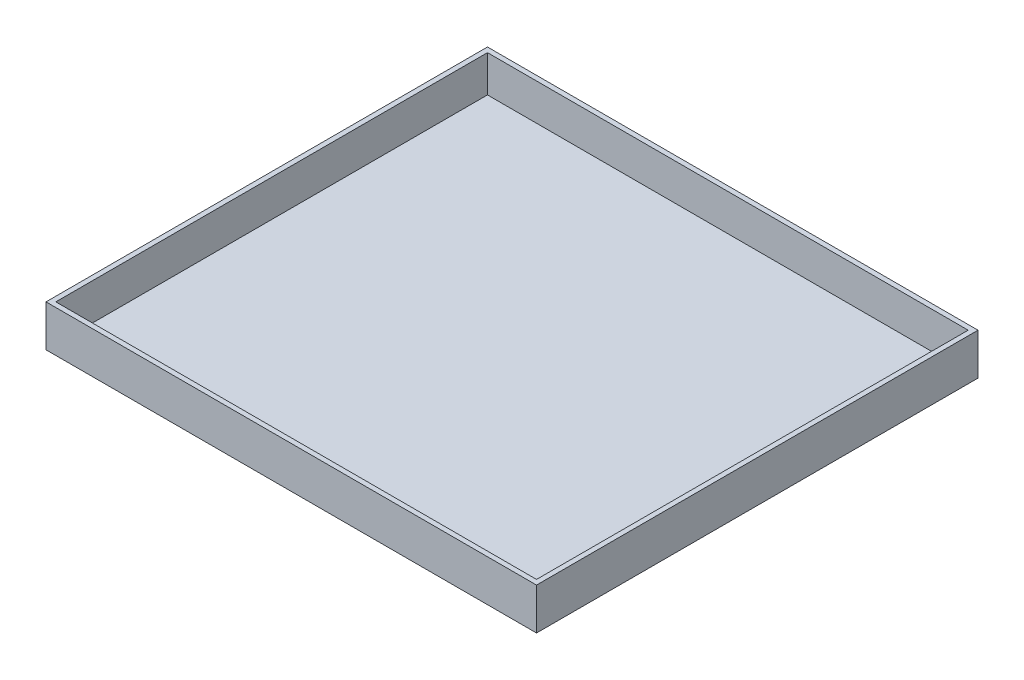
ISO-10303-21;
HEADER;
FILE_DESCRIPTION(('STEP AP214'),'2;1');
FILE_NAME('part.step','',(''),(''),'','','');
FILE_SCHEMA(('AUTOMOTIVE_DESIGN { 1 0 10303 214 1 1 1 1 }'));
ENDSEC;
DATA;
#1=APPLICATION_CONTEXT('core data for automotive mechanical design processes');
#2=APPLICATION_PROTOCOL_DEFINITION('international standard','automotive_design',2000,#1);
#3=PRODUCT_CONTEXT('',#1,'mechanical');
#4=PRODUCT('Part','Part','',(#3));
#5=PRODUCT_RELATED_PRODUCT_CATEGORY('part','',(#4));
#6=PRODUCT_DEFINITION_FORMATION('','',#4);
#7=PRODUCT_DEFINITION_CONTEXT('part definition',#1,'design');
#8=PRODUCT_DEFINITION('design','',#6,#7);
#9=PRODUCT_DEFINITION_SHAPE('','',#8);
#10=(LENGTH_UNIT() NAMED_UNIT(*) SI_UNIT(.MILLI.,.METRE.));
#11=(NAMED_UNIT(*) PLANE_ANGLE_UNIT() SI_UNIT($,.RADIAN.));
#12=(NAMED_UNIT(*) SI_UNIT($,.STERADIAN.) SOLID_ANGLE_UNIT());
#13=UNCERTAINTY_MEASURE_WITH_UNIT(LENGTH_MEASURE(1.E-05),#10,'distance_accuracy_value','');
#14=(GEOMETRIC_REPRESENTATION_CONTEXT(3) GLOBAL_UNCERTAINTY_ASSIGNED_CONTEXT((#13)) GLOBAL_UNIT_ASSIGNED_CONTEXT((#10,
#11,#12)) REPRESENTATION_CONTEXT('',''));
#15=CARTESIAN_POINT('',(0.,0.,0.));
#16=DIRECTION('',(0.,0.,1.));
#17=DIRECTION('',(1.,0.,0.));
#18=AXIS2_PLACEMENT_3D('',#15,#16,#17);
#19=CARTESIAN_POINT('',(-150.,25.4,135.));
#20=DIRECTION('',(1.,0.,0.));
#21=DIRECTION('',(0.,0.,-1.));
#22=AXIS2_PLACEMENT_3D('',#19,#20,#21);
#23=PLANE('',#22);
#24=DIRECTION('',(0.,0.,1.));
#25=VECTOR('',#24,1.);
#26=CARTESIAN_POINT('',(-150.,0.,135.));
#27=LINE('',#26,#25);
#28=CARTESIAN_POINT('',(-150.,0.,-135.));
#29=VERTEX_POINT('',#28);
#30=CARTESIAN_POINT('',(-150.,0.,135.));
#31=VERTEX_POINT('',#30);
#32=EDGE_CURVE('E147',#29,#31,#27,.T.);
#33=ORIENTED_EDGE('',*,*,#32,.T.);
#34=DIRECTION('',(0.,-1.,0.));
#35=VECTOR('',#34,1.);
#36=CARTESIAN_POINT('',(-150.,25.4,135.));
#37=LINE('',#36,#35);
#38=CARTESIAN_POINT('',(-150.,25.4,135.));
#39=VERTEX_POINT('',#38);
#40=EDGE_CURVE('E11',#39,#31,#37,.T.);
#41=ORIENTED_EDGE('',*,*,#40,.F.);
#42=DIRECTION('',(0.,0.,1.));
#43=VECTOR('',#42,1.);
#44=CARTESIAN_POINT('',(-150.,25.4,135.));
#45=LINE('',#44,#43);
#46=CARTESIAN_POINT('',(-150.,25.4,-135.));
#47=VERTEX_POINT('',#46);
#48=EDGE_CURVE('E140',#47,#39,#45,.T.);
#49=ORIENTED_EDGE('',*,*,#48,.F.);
#50=DIRECTION('',(0.,-1.,0.));
#51=VECTOR('',#50,1.);
#52=CARTESIAN_POINT('',(-150.,25.4,-135.));
#53=LINE('',#52,#51);
#54=EDGE_CURVE('E146',#47,#29,#53,.T.);
#55=ORIENTED_EDGE('',*,*,#54,.T.);
#56=EDGE_LOOP('',(#33,#41,#49,#55));
#57=FACE_BOUND('',#56,.T.);
#58=ADVANCED_FACE('F33',(#57),#23,.F.);
#59=CARTESIAN_POINT('',(150.,25.4,135.));
#60=DIRECTION('',(0.,0.,-1.));
#61=DIRECTION('',(-1.,0.,0.));
#62=AXIS2_PLACEMENT_3D('',#59,#60,#61);
#63=PLANE('',#62);
#64=DIRECTION('',(1.,0.,0.));
#65=VECTOR('',#64,1.);
#66=CARTESIAN_POINT('',(150.,0.,135.));
#67=LINE('',#66,#65);
#68=CARTESIAN_POINT('',(150.,0.,135.));
#69=VERTEX_POINT('',#68);
#70=EDGE_CURVE('E150',#31,#69,#67,.T.);
#71=ORIENTED_EDGE('',*,*,#70,.T.);
#72=DIRECTION('',(0.,-1.,0.));
#73=VECTOR('',#72,1.);
#74=CARTESIAN_POINT('',(150.,25.4,135.));
#75=LINE('',#74,#73);
#76=CARTESIAN_POINT('',(150.,25.4,135.));
#77=VERTEX_POINT('',#76);
#78=EDGE_CURVE('E40',#77,#69,#75,.T.);
#79=ORIENTED_EDGE('',*,*,#78,.F.);
#80=DIRECTION('',(1.,0.,0.));
#81=VECTOR('',#80,1.);
#82=CARTESIAN_POINT('',(150.,25.4,135.));
#83=LINE('',#82,#81);
#84=EDGE_CURVE('E84',#39,#77,#83,.T.);
#85=ORIENTED_EDGE('',*,*,#84,.F.);
#86=ORIENTED_EDGE('',*,*,#40,.T.);
#87=EDGE_LOOP('',(#71,#79,#85,#86));
#88=FACE_BOUND('',#87,.T.);
#89=ADVANCED_FACE('F179',(#88),#63,.F.);
#90=CARTESIAN_POINT('',(150.,25.4,135.));
#91=DIRECTION('',(-1.,0.,0.));
#92=DIRECTION('',(0.,0.,1.));
#93=AXIS2_PLACEMENT_3D('',#90,#91,#92);
#94=PLANE('',#93);
#95=DIRECTION('',(0.,0.,-1.));
#96=VECTOR('',#95,1.);
#97=CARTESIAN_POINT('',(150.,0.,135.));
#98=LINE('',#97,#96);
#99=CARTESIAN_POINT('',(150.,0.,-135.));
#100=VERTEX_POINT('',#99);
#101=EDGE_CURVE('E152',#69,#100,#98,.T.);
#102=ORIENTED_EDGE('',*,*,#101,.T.);
#103=DIRECTION('',(0.,-1.,0.));
#104=VECTOR('',#103,1.);
#105=CARTESIAN_POINT('',(150.,25.4,-135.));
#106=LINE('',#105,#104);
#107=CARTESIAN_POINT('',(150.,25.4,-135.));
#108=VERTEX_POINT('',#107);
#109=EDGE_CURVE('E156',#108,#100,#106,.T.);
#110=ORIENTED_EDGE('',*,*,#109,.F.);
#111=DIRECTION('',(0.,0.,-1.));
#112=VECTOR('',#111,1.);
#113=CARTESIAN_POINT('',(150.,25.4,135.));
#114=LINE('',#113,#112);
#115=EDGE_CURVE('E143',#77,#108,#114,.T.);
#116=ORIENTED_EDGE('',*,*,#115,.F.);
#117=ORIENTED_EDGE('',*,*,#78,.T.);
#118=EDGE_LOOP('',(#102,#110,#116,#117));
#119=FACE_BOUND('',#118,.T.);
#120=ADVANCED_FACE('F161',(#119),#94,.F.);
#121=CARTESIAN_POINT('',(150.,25.4,-135.));
#122=DIRECTION('',(0.,0.,1.));
#123=DIRECTION('',(1.,0.,0.));
#124=AXIS2_PLACEMENT_3D('',#121,#122,#123);
#125=PLANE('',#124);
#126=DIRECTION('',(-1.,0.,0.));
#127=VECTOR('',#126,1.);
#128=CARTESIAN_POINT('',(150.,0.,-135.));
#129=LINE('',#128,#127);
#130=EDGE_CURVE('E77',#100,#29,#129,.T.);
#131=ORIENTED_EDGE('',*,*,#130,.T.);
#132=ORIENTED_EDGE('',*,*,#54,.F.);
#133=DIRECTION('',(-1.,0.,0.));
#134=VECTOR('',#133,1.);
#135=CARTESIAN_POINT('',(150.,25.4,-135.));
#136=LINE('',#135,#134);
#137=EDGE_CURVE('E56',#108,#47,#136,.T.);
#138=ORIENTED_EDGE('',*,*,#137,.F.);
#139=ORIENTED_EDGE('',*,*,#109,.T.);
#140=EDGE_LOOP('',(#131,#132,#138,#139));
#141=FACE_BOUND('',#140,.T.);
#142=ADVANCED_FACE('F169',(#141),#125,.F.);
#143=CARTESIAN_POINT('',(0.,25.4,0.));
#144=DIRECTION('',(0.,1.,0.));
#145=DIRECTION('',(0.,0.,1.));
#146=AXIS2_PLACEMENT_3D('',#143,#144,#145);
#147=PLANE('',#146);
#148=DIRECTION('',(0.,0.,1.));
#149=VECTOR('',#148,1.);
#150=CARTESIAN_POINT('',(-147.,25.4,135.));
#151=LINE('',#150,#149);
#152=CARTESIAN_POINT('',(-147.,25.4,-132.));
#153=VERTEX_POINT('',#152);
#154=CARTESIAN_POINT('',(-147.,25.4,132.));
#155=VERTEX_POINT('',#154);
#156=EDGE_CURVE('E129',#153,#155,#151,.T.);
#157=ORIENTED_EDGE('',*,*,#156,.F.);
#158=DIRECTION('',(-1.,0.,0.));
#159=VECTOR('',#158,1.);
#160=CARTESIAN_POINT('',(150.,25.4,-132.));
#161=LINE('',#160,#159);
#162=CARTESIAN_POINT('',(147.,25.4,-132.));
#163=VERTEX_POINT('',#162);
#164=EDGE_CURVE('E138',#163,#153,#161,.T.);
#165=ORIENTED_EDGE('',*,*,#164,.F.);
#166=DIRECTION('',(0.,0.,-1.));
#167=VECTOR('',#166,1.);
#168=CARTESIAN_POINT('',(147.,25.4,135.));
#169=LINE('',#168,#167);
#170=CARTESIAN_POINT('',(147.,25.4,132.));
#171=VERTEX_POINT('',#170);
#172=EDGE_CURVE('E136',#171,#163,#169,.T.);
#173=ORIENTED_EDGE('',*,*,#172,.F.);
#174=DIRECTION('',(1.,0.,0.));
#175=VECTOR('',#174,1.);
#176=CARTESIAN_POINT('',(150.,25.4,132.));
#177=LINE('',#176,#175);
#178=EDGE_CURVE('E121',#155,#171,#177,.T.);
#179=ORIENTED_EDGE('',*,*,#178,.F.);
#180=EDGE_LOOP('',(#157,#165,#173,#179));
#181=FACE_BOUND('',#180,.T.);
#182=ORIENTED_EDGE('',*,*,#48,.T.);
#183=ORIENTED_EDGE('',*,*,#84,.T.);
#184=ORIENTED_EDGE('',*,*,#115,.T.);
#185=ORIENTED_EDGE('',*,*,#137,.T.);
#186=EDGE_LOOP('',(#182,#183,#184,#185));
#187=FACE_BOUND('',#186,.T.);
#188=ADVANCED_FACE('F171',(#181,#187),#147,.T.);
#189=CARTESIAN_POINT('',(0.,0.,0.));
#190=DIRECTION('',(0.,1.,0.));
#191=DIRECTION('',(0.,0.,1.));
#192=AXIS2_PLACEMENT_3D('',#189,#190,#191);
#193=PLANE('',#192);
#194=ORIENTED_EDGE('',*,*,#32,.F.);
#195=ORIENTED_EDGE('',*,*,#130,.F.);
#196=ORIENTED_EDGE('',*,*,#101,.F.);
#197=ORIENTED_EDGE('',*,*,#70,.F.);
#198=EDGE_LOOP('',(#194,#195,#196,#197));
#199=FACE_BOUND('',#198,.T.);
#200=ADVANCED_FACE('F165',(#199),#193,.F.);
#201=CARTESIAN_POINT('',(-147.,25.4,135.));
#202=DIRECTION('',(1.,0.,0.));
#203=DIRECTION('',(0.,0.,-1.));
#204=AXIS2_PLACEMENT_3D('',#201,#202,#203);
#205=PLANE('',#204);
#206=DIRECTION('',(0.,0.,1.));
#207=VECTOR('',#206,1.);
#208=CARTESIAN_POINT('',(-147.,3.,135.));
#209=LINE('',#208,#207);
#210=CARTESIAN_POINT('',(-147.,3.,-132.));
#211=VERTEX_POINT('',#210);
#212=CARTESIAN_POINT('',(-147.,3.,132.));
#213=VERTEX_POINT('',#212);
#214=EDGE_CURVE('E112',#211,#213,#209,.T.);
#215=ORIENTED_EDGE('',*,*,#214,.F.);
#216=DIRECTION('',(0.,-1.,0.));
#217=VECTOR('',#216,1.);
#218=CARTESIAN_POINT('',(-147.,25.4,-132.));
#219=LINE('',#218,#217);
#220=EDGE_CURVE('E132',#153,#211,#219,.T.);
#221=ORIENTED_EDGE('',*,*,#220,.F.);
#222=ORIENTED_EDGE('',*,*,#156,.T.);
#223=DIRECTION('',(0.,-1.,0.));
#224=VECTOR('',#223,1.);
#225=CARTESIAN_POINT('',(-147.,25.4,132.));
#226=LINE('',#225,#224);
#227=EDGE_CURVE('E124',#155,#213,#226,.T.);
#228=ORIENTED_EDGE('',*,*,#227,.T.);
#229=EDGE_LOOP('',(#215,#221,#222,#228));
#230=FACE_BOUND('',#229,.T.);
#231=ADVANCED_FACE('F206',(#230),#205,.T.);
#232=CARTESIAN_POINT('',(150.,25.4,132.));
#233=DIRECTION('',(0.,0.,-1.));
#234=DIRECTION('',(-1.,0.,0.));
#235=AXIS2_PLACEMENT_3D('',#232,#233,#234);
#236=PLANE('',#235);
#237=DIRECTION('',(1.,0.,0.));
#238=VECTOR('',#237,1.);
#239=CARTESIAN_POINT('',(150.,3.,132.));
#240=LINE('',#239,#238);
#241=CARTESIAN_POINT('',(147.,3.,132.));
#242=VERTEX_POINT('',#241);
#243=EDGE_CURVE('E106',#213,#242,#240,.T.);
#244=ORIENTED_EDGE('',*,*,#243,.F.);
#245=ORIENTED_EDGE('',*,*,#227,.F.);
#246=ORIENTED_EDGE('',*,*,#178,.T.);
#247=DIRECTION('',(0.,-1.,0.));
#248=VECTOR('',#247,1.);
#249=CARTESIAN_POINT('',(147.,25.4,132.));
#250=LINE('',#249,#248);
#251=EDGE_CURVE('E118',#171,#242,#250,.T.);
#252=ORIENTED_EDGE('',*,*,#251,.T.);
#253=EDGE_LOOP('',(#244,#245,#246,#252));
#254=FACE_BOUND('',#253,.T.);
#255=ADVANCED_FACE('F119',(#254),#236,.T.);
#256=CARTESIAN_POINT('',(147.,25.4,135.));
#257=DIRECTION('',(-1.,0.,0.));
#258=DIRECTION('',(0.,0.,1.));
#259=AXIS2_PLACEMENT_3D('',#256,#257,#258);
#260=PLANE('',#259);
#261=DIRECTION('',(0.,0.,-1.));
#262=VECTOR('',#261,1.);
#263=CARTESIAN_POINT('',(147.,3.,135.));
#264=LINE('',#263,#262);
#265=CARTESIAN_POINT('',(147.,3.,-132.));
#266=VERTEX_POINT('',#265);
#267=EDGE_CURVE('E110',#242,#266,#264,.T.);
#268=ORIENTED_EDGE('',*,*,#267,.F.);
#269=ORIENTED_EDGE('',*,*,#251,.F.);
#270=ORIENTED_EDGE('',*,*,#172,.T.);
#271=DIRECTION('',(0.,-1.,0.));
#272=VECTOR('',#271,1.);
#273=CARTESIAN_POINT('',(147.,25.4,-132.));
#274=LINE('',#273,#272);
#275=EDGE_CURVE('E47',#163,#266,#274,.T.);
#276=ORIENTED_EDGE('',*,*,#275,.T.);
#277=EDGE_LOOP('',(#268,#269,#270,#276));
#278=FACE_BOUND('',#277,.T.);
#279=ADVANCED_FACE('F126',(#278),#260,.T.);
#280=CARTESIAN_POINT('',(150.,25.4,-132.));
#281=DIRECTION('',(0.,0.,1.));
#282=DIRECTION('',(1.,0.,0.));
#283=AXIS2_PLACEMENT_3D('',#280,#281,#282);
#284=PLANE('',#283);
#285=DIRECTION('',(-1.,0.,0.));
#286=VECTOR('',#285,1.);
#287=CARTESIAN_POINT('',(150.,3.,-132.));
#288=LINE('',#287,#286);
#289=EDGE_CURVE('E127',#266,#211,#288,.T.);
#290=ORIENTED_EDGE('',*,*,#289,.F.);
#291=ORIENTED_EDGE('',*,*,#275,.F.);
#292=ORIENTED_EDGE('',*,*,#164,.T.);
#293=ORIENTED_EDGE('',*,*,#220,.T.);
#294=EDGE_LOOP('',(#290,#291,#292,#293));
#295=FACE_BOUND('',#294,.T.);
#296=ADVANCED_FACE('F236',(#295),#284,.T.);
#297=CARTESIAN_POINT('',(0.,3.,0.));
#298=DIRECTION('',(0.,1.,0.));
#299=DIRECTION('',(0.,0.,1.));
#300=AXIS2_PLACEMENT_3D('',#297,#298,#299);
#301=PLANE('',#300);
#302=ORIENTED_EDGE('',*,*,#214,.T.);
#303=ORIENTED_EDGE('',*,*,#243,.T.);
#304=ORIENTED_EDGE('',*,*,#267,.T.);
#305=ORIENTED_EDGE('',*,*,#289,.T.);
#306=EDGE_LOOP('',(#302,#303,#304,#305));
#307=FACE_BOUND('',#306,.T.);
#308=ADVANCED_FACE('F108',(#307),#301,.T.);
#309=CLOSED_SHELL('',(#58,#89,#120,#142,#188,#200,#231,#255,#279,#296,#308));
#310=MANIFOLD_SOLID_BREP('B2',#309);
#311=ADVANCED_BREP_SHAPE_REPRESENTATION('',(#18,#310),#14);
#312=SHAPE_DEFINITION_REPRESENTATION(#9,#311);
ENDSEC;
END-ISO-10303-21;
